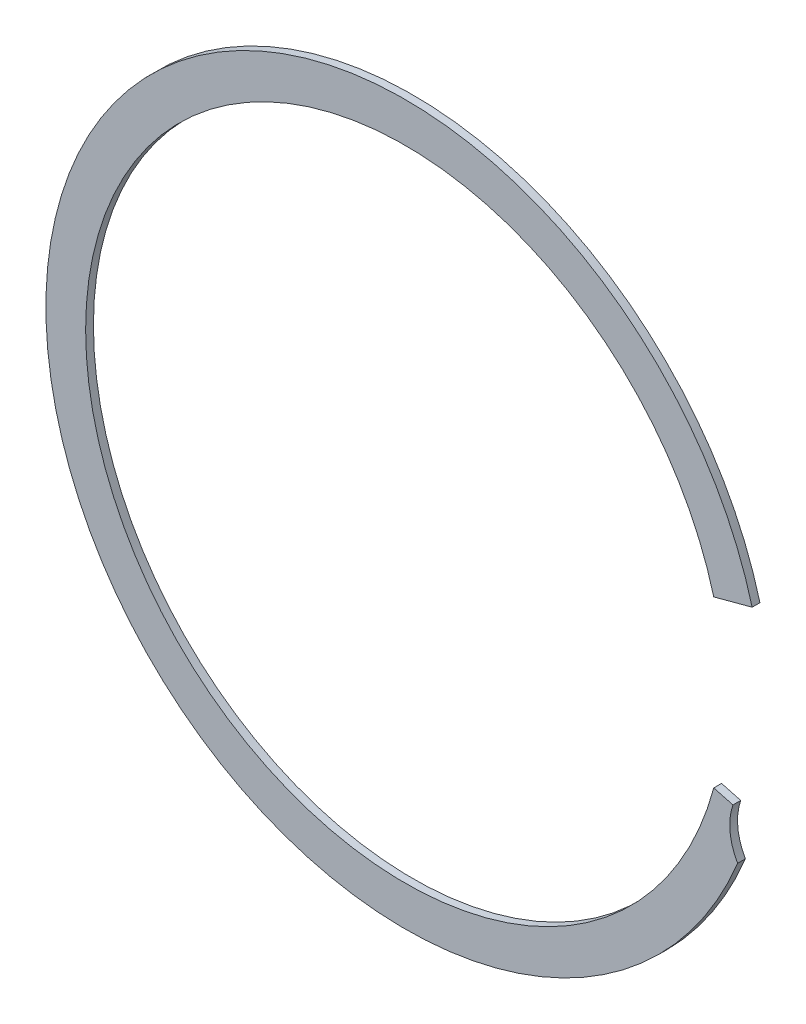
ISO-10303-21;
HEADER;
FILE_DESCRIPTION(('STEP AP214'),'2;1');
FILE_NAME('part.step','',(''),(''),'','','');
FILE_SCHEMA(('AUTOMOTIVE_DESIGN { 1 0 10303 214 1 1 1 1 }'));
ENDSEC;
DATA;
#1=APPLICATION_CONTEXT('core data for automotive mechanical design processes');
#2=APPLICATION_PROTOCOL_DEFINITION('international standard','automotive_design',2000,#1);
#3=PRODUCT_CONTEXT('',#1,'mechanical');
#4=PRODUCT('Part','Part','',(#3));
#5=PRODUCT_RELATED_PRODUCT_CATEGORY('part','',(#4));
#6=PRODUCT_DEFINITION_FORMATION('','',#4);
#7=PRODUCT_DEFINITION_CONTEXT('part definition',#1,'design');
#8=PRODUCT_DEFINITION('design','',#6,#7);
#9=PRODUCT_DEFINITION_SHAPE('','',#8);
#10=(LENGTH_UNIT() NAMED_UNIT(*) SI_UNIT(.MILLI.,.METRE.));
#11=(NAMED_UNIT(*) PLANE_ANGLE_UNIT() SI_UNIT($,.RADIAN.));
#12=(NAMED_UNIT(*) SI_UNIT($,.STERADIAN.) SOLID_ANGLE_UNIT());
#13=UNCERTAINTY_MEASURE_WITH_UNIT(LENGTH_MEASURE(1.E-05),#10,'distance_accuracy_value','');
#14=(GEOMETRIC_REPRESENTATION_CONTEXT(3) GLOBAL_UNCERTAINTY_ASSIGNED_CONTEXT((#13)) GLOBAL_UNIT_ASSIGNED_CONTEXT((#10,
#11,#12)) REPRESENTATION_CONTEXT('',''));
#15=CARTESIAN_POINT('',(0.,0.,0.));
#16=DIRECTION('',(0.,0.,1.));
#17=DIRECTION('',(1.,0.,0.));
#18=AXIS2_PLACEMENT_3D('',#15,#16,#17);
#19=CARTESIAN_POINT('',(38.6170548219961,-10.7949432966182,0.7874));
#20=DIRECTION('',(0.,0.,-1.));
#21=DIRECTION('',(-1.,0.,0.));
#22=AXIS2_PLACEMENT_3D('',#19,#20,#21);
#23=CYLINDRICAL_SURFACE('',#22,5.8338855089418);
#24=CARTESIAN_POINT('',(38.6170548219961,-10.7949432966182,0.));
#25=DIRECTION('',(0.,0.,-1.));
#26=DIRECTION('',(1.,0.,0.));
#27=AXIS2_PLACEMENT_3D('',#24,#25,#26);
#28=CIRCLE('',#27,5.8338855089418);
#29=CARTESIAN_POINT('',(33.5814804568812,-13.7406538976174,0.));
#30=VERTEX_POINT('',#29);
#31=CARTESIAN_POINT('',(33.1093293254583,-8.87161805469242,0.));
#32=VERTEX_POINT('',#31);
#33=EDGE_CURVE('E111',#30,#32,#28,.T.);
#34=ORIENTED_EDGE('',*,*,#33,.T.);
#35=DIRECTION('',(0.,0.,-1.));
#36=VECTOR('',#35,1.);
#37=CARTESIAN_POINT('',(33.1093293254583,-8.87161805469242,0.7874));
#38=LINE('',#37,#36);
#39=CARTESIAN_POINT('',(33.1093293254583,-8.87161805469242,0.7874));
#40=VERTEX_POINT('',#39);
#41=EDGE_CURVE('E11',#40,#32,#38,.T.);
#42=ORIENTED_EDGE('',*,*,#41,.F.);
#43=CARTESIAN_POINT('',(38.6170548219961,-10.7949432966182,0.7874));
#44=DIRECTION('',(0.,0.,-1.));
#45=DIRECTION('',(1.,0.,0.));
#46=AXIS2_PLACEMENT_3D('',#43,#44,#45);
#47=CIRCLE('',#46,5.8338855089418);
#48=CARTESIAN_POINT('',(33.5814804568812,-13.7406538976174,0.7874));
#49=VERTEX_POINT('',#48);
#50=EDGE_CURVE('E119',#49,#40,#47,.T.);
#51=ORIENTED_EDGE('',*,*,#50,.F.);
#52=DIRECTION('',(0.,0.,-1.));
#53=VECTOR('',#52,1.);
#54=CARTESIAN_POINT('',(33.5814804568812,-13.7406538976174,0.7874));
#55=LINE('',#54,#53);
#56=EDGE_CURVE('E107',#49,#30,#55,.T.);
#57=ORIENTED_EDGE('',*,*,#56,.T.);
#58=EDGE_LOOP('',(#34,#42,#51,#57));
#59=FACE_BOUND('',#58,.T.);
#60=ADVANCED_FACE('F37',(#59),#23,.F.);
#61=CARTESIAN_POINT('',(31.1711025624267,-8.35227175878972,0.7874));
#62=DIRECTION('',(-0.258819045102514,-0.96592582628907,0.));
#63=DIRECTION('',(0.96592582628907,-0.258819045102514,0.));
#64=AXIS2_PLACEMENT_3D('',#61,#62,#63);
#65=PLANE('',#64);
#66=DIRECTION('',(-0.96592582628907,0.258819045102514,0.));
#67=VECTOR('',#66,1.);
#68=CARTESIAN_POINT('',(31.1711025624267,-8.35227175878972,0.));
#69=LINE('',#68,#67);
#70=CARTESIAN_POINT('',(31.1711025624267,-8.35227175878972,0.));
#71=VERTEX_POINT('',#70);
#72=EDGE_CURVE('E114',#32,#71,#69,.T.);
#73=ORIENTED_EDGE('',*,*,#72,.T.);
#74=DIRECTION('',(0.,0.,-1.));
#75=VECTOR('',#74,1.);
#76=CARTESIAN_POINT('',(31.1711025624267,-8.35227175878972,0.7874));
#77=LINE('',#76,#75);
#78=CARTESIAN_POINT('',(31.1711025624267,-8.35227175878972,0.7874));
#79=VERTEX_POINT('',#78);
#80=EDGE_CURVE('E45',#79,#71,#77,.T.);
#81=ORIENTED_EDGE('',*,*,#80,.F.);
#82=DIRECTION('',(-0.96592582628907,0.258819045102514,0.));
#83=VECTOR('',#82,1.);
#84=CARTESIAN_POINT('',(31.1711025624267,-8.35227175878972,0.7874));
#85=LINE('',#84,#83);
#86=EDGE_CURVE('E86',#40,#79,#85,.T.);
#87=ORIENTED_EDGE('',*,*,#86,.F.);
#88=ORIENTED_EDGE('',*,*,#41,.T.);
#89=EDGE_LOOP('',(#73,#81,#87,#88));
#90=FACE_BOUND('',#89,.T.);
#91=ADVANCED_FACE('F138',(#90),#65,.F.);
#92=CARTESIAN_POINT('',(0.,0.,0.7874));
#93=DIRECTION('',(0.,0.,-1.));
#94=DIRECTION('',(-1.,0.,0.));
#95=AXIS2_PLACEMENT_3D('',#92,#93,#94);
#96=CYLINDRICAL_SURFACE('',#95,32.2707);
#97=CARTESIAN_POINT('',(0.,0.,0.));
#98=DIRECTION('',(0.,0.,-1.));
#99=DIRECTION('',(1.,0.,0.));
#100=AXIS2_PLACEMENT_3D('',#97,#98,#99);
#101=CIRCLE('',#100,32.2707);
#102=CARTESIAN_POINT('',(31.1711025624267,8.35227175878972,0.));
#103=VERTEX_POINT('',#102);
#104=EDGE_CURVE('E102',#71,#103,#101,.T.);
#105=ORIENTED_EDGE('',*,*,#104,.T.);
#106=DIRECTION('',(0.,0.,-1.));
#107=VECTOR('',#106,1.);
#108=CARTESIAN_POINT('',(31.1711025624267,8.35227175878972,0.7874));
#109=LINE('',#108,#107);
#110=CARTESIAN_POINT('',(31.1711025624267,8.35227175878972,0.7874));
#111=VERTEX_POINT('',#110);
#112=EDGE_CURVE('E99',#111,#103,#109,.T.);
#113=ORIENTED_EDGE('',*,*,#112,.F.);
#114=CARTESIAN_POINT('',(0.,0.,0.7874));
#115=DIRECTION('',(0.,0.,-1.));
#116=DIRECTION('',(1.,0.,0.));
#117=AXIS2_PLACEMENT_3D('',#114,#115,#116);
#118=CIRCLE('',#117,32.2707);
#119=EDGE_CURVE('E90',#79,#111,#118,.T.);
#120=ORIENTED_EDGE('',*,*,#119,.F.);
#121=ORIENTED_EDGE('',*,*,#80,.T.);
#122=EDGE_LOOP('',(#105,#113,#120,#121));
#123=FACE_BOUND('',#122,.T.);
#124=ADVANCED_FACE('F100',(#123),#96,.F.);
#125=CARTESIAN_POINT('',(33.1093293254583,8.87161805469243,0.7874));
#126=DIRECTION('',(-0.258819045102509,0.965925826289072,0.));
#127=DIRECTION('',(-0.965925826289072,-0.258819045102509,0.));
#128=AXIS2_PLACEMENT_3D('',#125,#126,#127);
#129=PLANE('',#128);
#130=DIRECTION('',(0.965925826289072,0.258819045102509,0.));
#131=VECTOR('',#130,1.);
#132=CARTESIAN_POINT('',(33.1093293254583,8.87161805469243,0.));
#133=LINE('',#132,#131);
#134=CARTESIAN_POINT('',(35.04755608849,9.39096435059512,0.));
#135=VERTEX_POINT('',#134);
#136=EDGE_CURVE('E72',#103,#135,#133,.T.);
#137=ORIENTED_EDGE('',*,*,#136,.T.);
#138=DIRECTION('',(0.,0.,-1.));
#139=VECTOR('',#138,1.);
#140=CARTESIAN_POINT('',(35.04755608849,9.39096435059512,0.7874));
#141=LINE('',#140,#139);
#142=CARTESIAN_POINT('',(35.04755608849,9.39096435059512,0.7874));
#143=VERTEX_POINT('',#142);
#144=EDGE_CURVE('E103',#143,#135,#141,.T.);
#145=ORIENTED_EDGE('',*,*,#144,.F.);
#146=DIRECTION('',(0.965925826289069,0.258819045102519,0.));
#147=VECTOR('',#146,1.);
#148=CARTESIAN_POINT('',(31.1711025624267,8.35227175878972,0.7874));
#149=LINE('',#148,#147);
#150=EDGE_CURVE('E94',#111,#143,#149,.T.);
#151=ORIENTED_EDGE('',*,*,#150,.F.);
#152=ORIENTED_EDGE('',*,*,#112,.T.);
#153=EDGE_LOOP('',(#137,#145,#151,#152));
#154=FACE_BOUND('',#153,.T.);
#155=ADVANCED_FACE('F105',(#154),#129,.F.);
#156=CARTESIAN_POINT('',(0.,0.,0.7874));
#157=DIRECTION('',(0.,0.,-1.));
#158=DIRECTION('',(-1.,0.,0.));
#159=AXIS2_PLACEMENT_3D('',#156,#157,#158);
#160=CYLINDRICAL_SURFACE('',#159,36.2839);
#161=CARTESIAN_POINT('',(0.,0.,0.));
#162=DIRECTION('',(0.,0.,1.));
#163=DIRECTION('',(1.,0.,0.));
#164=AXIS2_PLACEMENT_3D('',#161,#162,#163);
#165=CIRCLE('',#164,36.2839);
#166=EDGE_CURVE('E78',#135,#30,#165,.T.);
#167=ORIENTED_EDGE('',*,*,#166,.T.);
#168=ORIENTED_EDGE('',*,*,#56,.F.);
#169=CARTESIAN_POINT('',(0.,0.,0.7874));
#170=DIRECTION('',(0.,0.,1.));
#171=DIRECTION('',(1.,0.,0.));
#172=AXIS2_PLACEMENT_3D('',#169,#170,#171);
#173=CIRCLE('',#172,36.2839);
#174=EDGE_CURVE('E53',#143,#49,#173,.T.);
#175=ORIENTED_EDGE('',*,*,#174,.F.);
#176=ORIENTED_EDGE('',*,*,#144,.T.);
#177=EDGE_LOOP('',(#167,#168,#175,#176));
#178=FACE_BOUND('',#177,.T.);
#179=ADVANCED_FACE('F127',(#178),#160,.T.);
#180=CARTESIAN_POINT('',(38.6170548219961,-10.7949432966182,0.7874));
#181=DIRECTION('',(0.,0.,1.));
#182=DIRECTION('',(1.,0.,0.));
#183=AXIS2_PLACEMENT_3D('',#180,#181,#182);
#184=PLANE('',#183);
#185=ORIENTED_EDGE('',*,*,#50,.T.);
#186=ORIENTED_EDGE('',*,*,#86,.T.);
#187=ORIENTED_EDGE('',*,*,#119,.T.);
#188=ORIENTED_EDGE('',*,*,#150,.T.);
#189=ORIENTED_EDGE('',*,*,#174,.T.);
#190=EDGE_LOOP('',(#185,#186,#187,#188,#189));
#191=FACE_BOUND('',#190,.T.);
#192=ADVANCED_FACE('F92',(#191),#184,.T.);
#193=CARTESIAN_POINT('',(38.6170548219961,-10.7949432966182,0.));
#194=DIRECTION('',(0.,0.,1.));
#195=DIRECTION('',(1.,0.,0.));
#196=AXIS2_PLACEMENT_3D('',#193,#194,#195);
#197=PLANE('',#196);
#198=ORIENTED_EDGE('',*,*,#33,.F.);
#199=ORIENTED_EDGE('',*,*,#166,.F.);
#200=ORIENTED_EDGE('',*,*,#136,.F.);
#201=ORIENTED_EDGE('',*,*,#104,.F.);
#202=ORIENTED_EDGE('',*,*,#72,.F.);
#203=EDGE_LOOP('',(#198,#199,#200,#201,#202));
#204=FACE_BOUND('',#203,.T.);
#205=ADVANCED_FACE('F123',(#204),#197,.F.);
#206=CLOSED_SHELL('',(#60,#91,#124,#155,#179,#192,#205));
#207=MANIFOLD_SOLID_BREP('B2',#206);
#208=ADVANCED_BREP_SHAPE_REPRESENTATION('',(#18,#207),#14);
#209=SHAPE_DEFINITION_REPRESENTATION(#9,#208);
ENDSEC;
END-ISO-10303-21;
